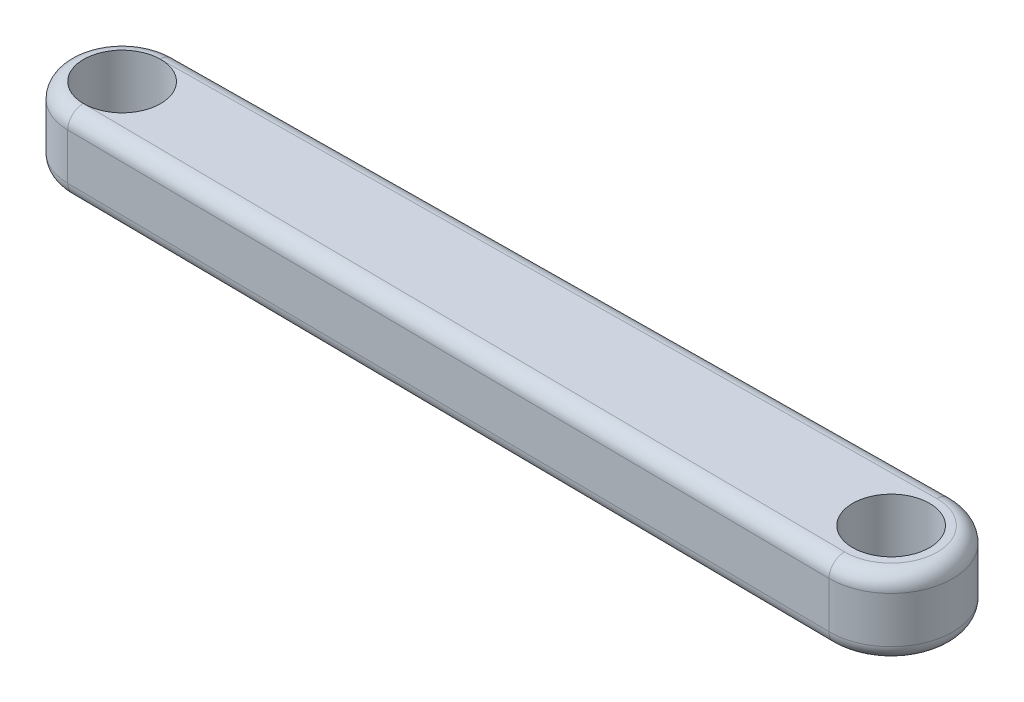
ISO-10303-21;
HEADER;
FILE_DESCRIPTION(('STEP AP214'),'2;1');
FILE_NAME('part.step','',(''),(''),'','','');
FILE_SCHEMA(('AUTOMOTIVE_DESIGN { 1 0 10303 214 1 1 1 1 }'));
ENDSEC;
DATA;
#1=APPLICATION_CONTEXT('core data for automotive mechanical design processes');
#2=APPLICATION_PROTOCOL_DEFINITION('international standard','automotive_design',2000,#1);
#3=PRODUCT_CONTEXT('',#1,'mechanical');
#4=PRODUCT('Part','Part','',(#3));
#5=PRODUCT_RELATED_PRODUCT_CATEGORY('part','',(#4));
#6=PRODUCT_DEFINITION_FORMATION('','',#4);
#7=PRODUCT_DEFINITION_CONTEXT('part definition',#1,'design');
#8=PRODUCT_DEFINITION('design','',#6,#7);
#9=PRODUCT_DEFINITION_SHAPE('','',#8);
#10=(LENGTH_UNIT() NAMED_UNIT(*) SI_UNIT(.MILLI.,.METRE.));
#11=(NAMED_UNIT(*) PLANE_ANGLE_UNIT() SI_UNIT($,.RADIAN.));
#12=(NAMED_UNIT(*) SI_UNIT($,.STERADIAN.) SOLID_ANGLE_UNIT());
#13=UNCERTAINTY_MEASURE_WITH_UNIT(LENGTH_MEASURE(1.E-05),#10,'distance_accuracy_value','');
#14=(GEOMETRIC_REPRESENTATION_CONTEXT(3) GLOBAL_UNCERTAINTY_ASSIGNED_CONTEXT((#13)) GLOBAL_UNIT_ASSIGNED_CONTEXT((#10,
#11,#12)) REPRESENTATION_CONTEXT('',''));
#15=CARTESIAN_POINT('',(0.,0.,0.));
#16=DIRECTION('',(0.,0.,1.));
#17=DIRECTION('',(1.,0.,0.));
#18=AXIS2_PLACEMENT_3D('',#15,#16,#17);
#19=CARTESIAN_POINT('',(-150.,50.,0.));
#20=DIRECTION('',(0.,1.,0.));
#21=DIRECTION('',(0.,0.,1.));
#22=AXIS2_PLACEMENT_3D('',#19,#20,#21);
#23=PLANE('',#22);
#24=CARTESIAN_POINT('',(-150.,50.,0.));
#25=DIRECTION('',(0.,1.,0.));
#26=DIRECTION('',(0.,0.,1.));
#27=AXIS2_PLACEMENT_3D('',#24,#25,#26);
#28=CIRCLE('',#27,25.);
#29=CARTESIAN_POINT('',(-150.25,50.,24.9987499687484));
#30=VERTEX_POINT('',#29);
#31=CARTESIAN_POINT('',(-150.25,50.,-24.9987499687485));
#32=VERTEX_POINT('',#31);
#33=EDGE_CURVE('E174',#30,#32,#28,.T.);
#34=ORIENTED_EDGE('',*,*,#33,.F.);
#35=DIRECTION('',(0.999949998749938,0.,0.00999999999999997));
#36=VECTOR('',#35,1.);
#37=CARTESIAN_POINT('',(349.7,50.,29.9984999624981));
#38=LINE('',#37,#36);
#39=CARTESIAN_POINT('',(349.7,50.,29.9984999624981));
#40=VERTEX_POINT('',#39);
#41=EDGE_CURVE('E54',#30,#40,#38,.T.);
#42=ORIENTED_EDGE('',*,*,#41,.T.);
#43=CARTESIAN_POINT('',(350.,50.,0.));
#44=DIRECTION('',(0.,1.,0.));
#45=DIRECTION('',(0.,0.,1.));
#46=AXIS2_PLACEMENT_3D('',#43,#44,#45);
#47=CIRCLE('',#46,30.);
#48=CARTESIAN_POINT('',(349.7,50.,-29.9984999624981));
#49=VERTEX_POINT('',#48);
#50=EDGE_CURVE('E199',#40,#49,#47,.T.);
#51=ORIENTED_EDGE('',*,*,#50,.T.);
#52=DIRECTION('',(-0.999949998749938,0.,0.00999999999999997));
#53=VECTOR('',#52,1.);
#54=CARTESIAN_POINT('',(-150.25,50.,-24.9987499687485));
#55=LINE('',#54,#53);
#56=EDGE_CURVE('E133',#49,#32,#55,.T.);
#57=ORIENTED_EDGE('',*,*,#56,.T.);
#58=EDGE_LOOP('',(#34,#42,#51,#57));
#59=FACE_BOUND('',#58,.T.);
#60=CARTESIAN_POINT('',(350.,50.,0.));
#61=DIRECTION('',(0.,1.,0.));
#62=DIRECTION('',(0.,0.,1.));
#63=AXIS2_PLACEMENT_3D('',#60,#61,#62);
#64=CIRCLE('',#63,25.);
#65=CARTESIAN_POINT('',(350.,50.,25.));
#66=VERTEX_POINT('',#65);
#67=EDGE_CURVE('E163',#66,#66,#64,.T.);
#68=ORIENTED_EDGE('',*,*,#67,.F.);
#69=EDGE_LOOP('',(#68));
#70=FACE_BOUND('',#69,.T.);
#71=ADVANCED_FACE('F37',(#59,#70),#23,.T.);
#72=CARTESIAN_POINT('',(-150.,0.,0.));
#73=DIRECTION('',(0.,1.,0.));
#74=DIRECTION('',(0.,0.,1.));
#75=AXIS2_PLACEMENT_3D('',#72,#73,#74);
#76=PLANE('',#75);
#77=CARTESIAN_POINT('',(350.,0.,0.));
#78=DIRECTION('',(0.,1.,0.));
#79=DIRECTION('',(0.,0.,1.));
#80=AXIS2_PLACEMENT_3D('',#77,#78,#79);
#81=CIRCLE('',#80,30.);
#82=CARTESIAN_POINT('',(349.7,0.,-29.9984999624981));
#83=VERTEX_POINT('',#82);
#84=CARTESIAN_POINT('',(349.7,0.,29.9984999624981));
#85=VERTEX_POINT('',#84);
#86=EDGE_CURVE('E185',#83,#85,#81,.F.);
#87=ORIENTED_EDGE('',*,*,#86,.T.);
#88=DIRECTION('',(0.999949998749938,0.,0.00999999999999997));
#89=VECTOR('',#88,1.);
#90=CARTESIAN_POINT('',(-150.25,0.,24.9987499687485));
#91=LINE('',#90,#89);
#92=CARTESIAN_POINT('',(-150.25,0.,24.9987499687484));
#93=VERTEX_POINT('',#92);
#94=EDGE_CURVE('E188',#85,#93,#91,.F.);
#95=ORIENTED_EDGE('',*,*,#94,.T.);
#96=CARTESIAN_POINT('',(-150.,0.,0.));
#97=DIRECTION('',(0.,1.,0.));
#98=DIRECTION('',(0.,0.,1.));
#99=AXIS2_PLACEMENT_3D('',#96,#97,#98);
#100=CIRCLE('',#99,25.);
#101=CARTESIAN_POINT('',(-150.25,0.,-24.9987499687485));
#102=VERTEX_POINT('',#101);
#103=EDGE_CURVE('E168',#93,#102,#100,.T.);
#104=ORIENTED_EDGE('',*,*,#103,.T.);
#105=DIRECTION('',(-0.999949998749938,0.,0.00999999999999997));
#106=VECTOR('',#105,1.);
#107=CARTESIAN_POINT('',(-150.25,0.,-24.9987499687485));
#108=LINE('',#107,#106);
#109=EDGE_CURVE('E183',#102,#83,#108,.F.);
#110=ORIENTED_EDGE('',*,*,#109,.T.);
#111=EDGE_LOOP('',(#87,#95,#104,#110));
#112=FACE_BOUND('',#111,.T.);
#113=CARTESIAN_POINT('',(350.,0.,0.));
#114=DIRECTION('',(0.,1.,0.));
#115=DIRECTION('',(0.,0.,1.));
#116=AXIS2_PLACEMENT_3D('',#113,#114,#115);
#117=CIRCLE('',#116,25.);
#118=CARTESIAN_POINT('',(350.,0.,25.));
#119=VERTEX_POINT('',#118);
#120=EDGE_CURVE('E157',#119,#119,#117,.T.);
#121=ORIENTED_EDGE('',*,*,#120,.T.);
#122=EDGE_LOOP('',(#121));
#123=FACE_BOUND('',#122,.T.);
#124=ADVANCED_FACE('F232',(#112,#123),#76,.F.);
#125=CARTESIAN_POINT('',(-150.,50.,0.));
#126=DIRECTION('',(0.,-1.,0.));
#127=DIRECTION('',(0.,0.,-1.));
#128=AXIS2_PLACEMENT_3D('',#125,#126,#127);
#129=CYLINDRICAL_SURFACE('',#128,35.);
#130=DIRECTION('',(0.,-1.,0.));
#131=VECTOR('',#130,1.);
#132=CARTESIAN_POINT('',(-150.35,50.,-34.9982499562478));
#133=LINE('',#132,#131);
#134=CARTESIAN_POINT('',(-150.35,40.,-34.9982499562478));
#135=VERTEX_POINT('',#134);
#136=CARTESIAN_POINT('',(-150.35,10.,-34.9982499562478));
#137=VERTEX_POINT('',#136);
#138=EDGE_CURVE('E111',#135,#137,#133,.T.);
#139=ORIENTED_EDGE('',*,*,#138,.T.);
#140=CARTESIAN_POINT('',(-150.,10.,0.));
#141=DIRECTION('',(0.,1.,0.));
#142=DIRECTION('',(0.,0.,1.));
#143=AXIS2_PLACEMENT_3D('',#140,#141,#142);
#144=CIRCLE('',#143,35.);
#145=CARTESIAN_POINT('',(-150.35,10.,34.9982499562478));
#146=VERTEX_POINT('',#145);
#147=EDGE_CURVE('E196',#137,#146,#144,.T.);
#148=ORIENTED_EDGE('',*,*,#147,.T.);
#149=DIRECTION('',(0.,-1.,0.));
#150=VECTOR('',#149,1.);
#151=CARTESIAN_POINT('',(-150.35,50.,34.9982499562478));
#152=LINE('',#151,#150);
#153=CARTESIAN_POINT('',(-150.35,40.,34.9982499562478));
#154=VERTEX_POINT('',#153);
#155=EDGE_CURVE('E130',#154,#146,#152,.T.);
#156=ORIENTED_EDGE('',*,*,#155,.F.);
#157=CARTESIAN_POINT('',(-150.,40.,0.));
#158=DIRECTION('',(0.,1.,0.));
#159=DIRECTION('',(0.,0.,1.));
#160=AXIS2_PLACEMENT_3D('',#157,#158,#159);
#161=CIRCLE('',#160,35.);
#162=EDGE_CURVE('E194',#154,#135,#161,.F.);
#163=ORIENTED_EDGE('',*,*,#162,.T.);
#164=EDGE_LOOP('',(#139,#148,#156,#163));
#165=FACE_BOUND('',#164,.T.);
#166=ADVANCED_FACE('F214',(#165),#129,.T.);
#167=CARTESIAN_POINT('',(-150.35,50.,34.9982499562478));
#168=DIRECTION('',(0.00999999999999997,0.,-0.999949998749938));
#169=DIRECTION('',(-0.999949998749938,0.,-0.00999999999999997));
#170=AXIS2_PLACEMENT_3D('',#167,#168,#169);
#171=PLANE('',#170);
#172=ORIENTED_EDGE('',*,*,#155,.T.);
#173=DIRECTION('',(0.999949998749938,0.,0.00999999999999997));
#174=VECTOR('',#173,1.);
#175=CARTESIAN_POINT('',(-150.35,10.,34.9982499562478));
#176=LINE('',#175,#174);
#177=CARTESIAN_POINT('',(349.6,10.,39.9979999499975));
#178=VERTEX_POINT('',#177);
#179=EDGE_CURVE('E192',#146,#178,#176,.T.);
#180=ORIENTED_EDGE('',*,*,#179,.T.);
#181=DIRECTION('',(0.,-1.,0.));
#182=VECTOR('',#181,1.);
#183=CARTESIAN_POINT('',(349.6,50.,39.9979999499975));
#184=LINE('',#183,#182);
#185=CARTESIAN_POINT('',(349.6,40.,39.9979999499975));
#186=VERTEX_POINT('',#185);
#187=EDGE_CURVE('E125',#186,#178,#184,.T.);
#188=ORIENTED_EDGE('',*,*,#187,.F.);
#189=DIRECTION('',(0.999949998749938,0.,0.00999999999999997));
#190=VECTOR('',#189,1.);
#191=CARTESIAN_POINT('',(-150.35,40.,34.9982499562478));
#192=LINE('',#191,#190);
#193=EDGE_CURVE('E190',#186,#154,#192,.F.);
#194=ORIENTED_EDGE('',*,*,#193,.T.);
#195=EDGE_LOOP('',(#172,#180,#188,#194));
#196=FACE_BOUND('',#195,.T.);
#197=ADVANCED_FACE('F212',(#196),#171,.F.);
#198=CARTESIAN_POINT('',(350.,50.,0.));
#199=DIRECTION('',(0.,-1.,0.));
#200=DIRECTION('',(0.,0.,-1.));
#201=AXIS2_PLACEMENT_3D('',#198,#199,#200);
#202=CYLINDRICAL_SURFACE('',#201,40.);
#203=ORIENTED_EDGE('',*,*,#187,.T.);
#204=CARTESIAN_POINT('',(350.,10.,0.));
#205=DIRECTION('',(0.,1.,0.));
#206=DIRECTION('',(0.,0.,1.));
#207=AXIS2_PLACEMENT_3D('',#204,#205,#206);
#208=CIRCLE('',#207,40.);
#209=CARTESIAN_POINT('',(349.6,10.,-39.9979999499975));
#210=VERTEX_POINT('',#209);
#211=EDGE_CURVE('E124',#178,#210,#208,.T.);
#212=ORIENTED_EDGE('',*,*,#211,.T.);
#213=DIRECTION('',(0.,-1.,0.));
#214=VECTOR('',#213,1.);
#215=CARTESIAN_POINT('',(349.6,50.,-39.9979999499975));
#216=LINE('',#215,#214);
#217=CARTESIAN_POINT('',(349.6,40.,-39.9979999499975));
#218=VERTEX_POINT('',#217);
#219=EDGE_CURVE('E109',#218,#210,#216,.T.);
#220=ORIENTED_EDGE('',*,*,#219,.F.);
#221=CARTESIAN_POINT('',(350.,40.,0.));
#222=DIRECTION('',(0.,1.,0.));
#223=DIRECTION('',(0.,0.,1.));
#224=AXIS2_PLACEMENT_3D('',#221,#222,#223);
#225=CIRCLE('',#224,40.);
#226=EDGE_CURVE('E121',#218,#186,#225,.F.);
#227=ORIENTED_EDGE('',*,*,#226,.T.);
#228=EDGE_LOOP('',(#203,#212,#220,#227));
#229=FACE_BOUND('',#228,.T.);
#230=ADVANCED_FACE('F120',(#229),#202,.T.);
#231=CARTESIAN_POINT('',(-150.35,50.,-34.9982499562478));
#232=DIRECTION('',(0.00999999999999997,0.,0.999949998749938));
#233=DIRECTION('',(0.999949998749938,0.,-0.00999999999999997));
#234=AXIS2_PLACEMENT_3D('',#231,#232,#233);
#235=PLANE('',#234);
#236=ORIENTED_EDGE('',*,*,#219,.T.);
#237=DIRECTION('',(-0.999949998749938,0.,0.00999999999999997));
#238=VECTOR('',#237,1.);
#239=CARTESIAN_POINT('',(-150.35,10.,-34.9982499562478));
#240=LINE('',#239,#238);
#241=EDGE_CURVE('E11',#210,#137,#240,.T.);
#242=ORIENTED_EDGE('',*,*,#241,.T.);
#243=ORIENTED_EDGE('',*,*,#138,.F.);
#244=DIRECTION('',(-0.999949998749938,0.,0.00999999999999997));
#245=VECTOR('',#244,1.);
#246=CARTESIAN_POINT('',(349.6,40.,-39.9979999499975));
#247=LINE('',#246,#245);
#248=EDGE_CURVE('E46',#135,#218,#247,.F.);
#249=ORIENTED_EDGE('',*,*,#248,.T.);
#250=EDGE_LOOP('',(#236,#242,#243,#249));
#251=FACE_BOUND('',#250,.T.);
#252=ADVANCED_FACE('F108',(#251),#235,.F.);
#253=CARTESIAN_POINT('',(-150.,50.,0.));
#254=DIRECTION('',(0.,-1.,0.));
#255=DIRECTION('',(0.,0.,-1.));
#256=AXIS2_PLACEMENT_3D('',#253,#254,#255);
#257=CYLINDRICAL_SURFACE('',#256,25.);
#258=EDGE_CURVE('E171',#32,#30,#28,.T.);
#259=ORIENTED_EDGE('',*,*,#258,.T.);
#260=ORIENTED_EDGE('',*,*,#33,.T.);
#261=EDGE_LOOP('',(#259,#260));
#262=FACE_BOUND('',#261,.T.);
#263=EDGE_CURVE('E175',#102,#93,#100,.T.);
#264=ORIENTED_EDGE('',*,*,#263,.F.);
#265=ORIENTED_EDGE('',*,*,#103,.F.);
#266=EDGE_LOOP('',(#264,#265));
#267=FACE_BOUND('',#266,.T.);
#268=ADVANCED_FACE('F205',(#262,#267),#257,.F.);
#269=CARTESIAN_POINT('',(350.,50.,0.));
#270=DIRECTION('',(0.,-1.,0.));
#271=DIRECTION('',(0.,0.,-1.));
#272=AXIS2_PLACEMENT_3D('',#269,#270,#271);
#273=CYLINDRICAL_SURFACE('',#272,25.);
#274=ORIENTED_EDGE('',*,*,#67,.T.);
#275=EDGE_LOOP('',(#274));
#276=FACE_BOUND('',#275,.T.);
#277=ORIENTED_EDGE('',*,*,#120,.F.);
#278=EDGE_LOOP('',(#277));
#279=FACE_BOUND('',#278,.T.);
#280=ADVANCED_FACE('F270',(#276,#279),#273,.F.);
#281=CARTESIAN_POINT('',(-150.,10.,0.));
#282=DIRECTION('',(0.,1.,0.));
#283=DIRECTION('',(0.,0.,1.));
#284=AXIS2_PLACEMENT_3D('',#281,#282,#283);
#285=TOROIDAL_SURFACE('',#284,25.,10.);
#286=CARTESIAN_POINT('',(-150.25,10.,-24.9987499687485));
#287=DIRECTION('',(0.999949998749938,0.,-0.0099999999999989));
#288=DIRECTION('',(-0.0099999999999989,0.,-0.999949998749938));
#289=AXIS2_PLACEMENT_3D('',#286,#287,#288);
#290=CIRCLE('',#289,10.);
#291=EDGE_CURVE('E150',#102,#137,#290,.T.);
#292=ORIENTED_EDGE('',*,*,#291,.F.);
#293=ORIENTED_EDGE('',*,*,#263,.T.);
#294=CARTESIAN_POINT('',(-150.25,10.,24.9987499687485));
#295=DIRECTION('',(0.999949998749938,0.,0.0099999999999989));
#296=DIRECTION('',(0.0099999999999989,0.,-0.999949998749938));
#297=AXIS2_PLACEMENT_3D('',#294,#295,#296);
#298=CIRCLE('',#297,10.);
#299=EDGE_CURVE('E138',#146,#93,#298,.T.);
#300=ORIENTED_EDGE('',*,*,#299,.F.);
#301=ORIENTED_EDGE('',*,*,#147,.F.);
#302=EDGE_LOOP('',(#292,#293,#300,#301));
#303=FACE_BOUND('',#302,.T.);
#304=ADVANCED_FACE('F217',(#303),#285,.T.);
#305=CARTESIAN_POINT('',(-150.25,10.,24.9987499687485));
#306=DIRECTION('',(0.999949998749938,0.,0.00999999999999997));
#307=DIRECTION('',(0.00999999999999997,0.,-0.999949998749938));
#308=AXIS2_PLACEMENT_3D('',#305,#306,#307);
#309=CYLINDRICAL_SURFACE('',#308,10.);
#310=ORIENTED_EDGE('',*,*,#299,.T.);
#311=ORIENTED_EDGE('',*,*,#94,.F.);
#312=CARTESIAN_POINT('',(349.7,10.,29.9984999624981));
#313=DIRECTION('',(0.999949998749938,0.,0.0099999999999989));
#314=DIRECTION('',(0.0099999999999989,0.,-0.999949998749938));
#315=AXIS2_PLACEMENT_3D('',#312,#313,#314);
#316=CIRCLE('',#315,10.);
#317=EDGE_CURVE('E144',#178,#85,#316,.T.);
#318=ORIENTED_EDGE('',*,*,#317,.F.);
#319=ORIENTED_EDGE('',*,*,#179,.F.);
#320=EDGE_LOOP('',(#310,#311,#318,#319));
#321=FACE_BOUND('',#320,.T.);
#322=ADVANCED_FACE('F220',(#321),#309,.T.);
#323=CARTESIAN_POINT('',(-150.25,10.,-24.9987499687485));
#324=DIRECTION('',(-0.999949998749938,0.,0.00999999999999997));
#325=DIRECTION('',(0.00999999999999997,0.,0.999949998749938));
#326=AXIS2_PLACEMENT_3D('',#323,#324,#325);
#327=CYLINDRICAL_SURFACE('',#326,10.);
#328=ORIENTED_EDGE('',*,*,#291,.T.);
#329=ORIENTED_EDGE('',*,*,#241,.F.);
#330=CARTESIAN_POINT('',(349.7,10.,-29.9984999624981));
#331=DIRECTION('',(0.999949998749938,0.,-0.0099999999999989));
#332=DIRECTION('',(-0.0099999999999989,0.,-0.999949998749938));
#333=AXIS2_PLACEMENT_3D('',#330,#331,#332);
#334=CIRCLE('',#333,10.);
#335=EDGE_CURVE('E141',#83,#210,#334,.T.);
#336=ORIENTED_EDGE('',*,*,#335,.F.);
#337=ORIENTED_EDGE('',*,*,#109,.F.);
#338=EDGE_LOOP('',(#328,#329,#336,#337));
#339=FACE_BOUND('',#338,.T.);
#340=ADVANCED_FACE('F223',(#339),#327,.T.);
#341=CARTESIAN_POINT('',(350.,10.,0.));
#342=DIRECTION('',(0.,1.,0.));
#343=DIRECTION('',(0.,0.,1.));
#344=AXIS2_PLACEMENT_3D('',#341,#342,#343);
#345=TOROIDAL_SURFACE('',#344,30.,10.);
#346=ORIENTED_EDGE('',*,*,#317,.T.);
#347=ORIENTED_EDGE('',*,*,#86,.F.);
#348=ORIENTED_EDGE('',*,*,#335,.T.);
#349=ORIENTED_EDGE('',*,*,#211,.F.);
#350=EDGE_LOOP('',(#346,#347,#348,#349));
#351=FACE_BOUND('',#350,.T.);
#352=ADVANCED_FACE('F221',(#351),#345,.T.);
#353=CARTESIAN_POINT('',(-150.,40.,0.));
#354=DIRECTION('',(0.,1.,0.));
#355=DIRECTION('',(0.,0.,1.));
#356=AXIS2_PLACEMENT_3D('',#353,#354,#355);
#357=TOROIDAL_SURFACE('',#356,25.,10.);
#358=CARTESIAN_POINT('',(-150.25,40.,-24.9987499687485));
#359=DIRECTION('',(0.999949998749938,0.,-0.0099999999999989));
#360=DIRECTION('',(-0.0099999999999989,0.,-0.999949998749938));
#361=AXIS2_PLACEMENT_3D('',#358,#359,#360);
#362=CIRCLE('',#361,10.);
#363=EDGE_CURVE('E135',#135,#32,#362,.T.);
#364=ORIENTED_EDGE('',*,*,#363,.F.);
#365=ORIENTED_EDGE('',*,*,#162,.F.);
#366=CARTESIAN_POINT('',(-150.25,40.,24.9987499687485));
#367=DIRECTION('',(0.999949998749938,0.,0.0099999999999989));
#368=DIRECTION('',(0.0099999999999989,0.,-0.999949998749938));
#369=AXIS2_PLACEMENT_3D('',#366,#367,#368);
#370=CIRCLE('',#369,10.);
#371=EDGE_CURVE('E41',#30,#154,#370,.T.);
#372=ORIENTED_EDGE('',*,*,#371,.F.);
#373=ORIENTED_EDGE('',*,*,#258,.F.);
#374=EDGE_LOOP('',(#364,#365,#372,#373));
#375=FACE_BOUND('',#374,.T.);
#376=ADVANCED_FACE('F39',(#375),#357,.T.);
#377=CARTESIAN_POINT('',(-150.25,40.,24.9987499687485));
#378=DIRECTION('',(-0.999949998749938,0.,-0.00999999999999997));
#379=DIRECTION('',(-0.00999999999999997,0.,0.999949998749938));
#380=AXIS2_PLACEMENT_3D('',#377,#378,#379);
#381=CYLINDRICAL_SURFACE('',#380,10.);
#382=ORIENTED_EDGE('',*,*,#371,.T.);
#383=ORIENTED_EDGE('',*,*,#193,.F.);
#384=CARTESIAN_POINT('',(349.7,40.,29.9984999624981));
#385=DIRECTION('',(0.999949998749938,0.,0.0099999999999989));
#386=DIRECTION('',(0.0099999999999989,0.,-0.999949998749938));
#387=AXIS2_PLACEMENT_3D('',#384,#385,#386);
#388=CIRCLE('',#387,10.);
#389=EDGE_CURVE('E128',#40,#186,#388,.T.);
#390=ORIENTED_EDGE('',*,*,#389,.F.);
#391=ORIENTED_EDGE('',*,*,#41,.F.);
#392=EDGE_LOOP('',(#382,#383,#390,#391));
#393=FACE_BOUND('',#392,.T.);
#394=ADVANCED_FACE('F209',(#393),#381,.T.);
#395=CARTESIAN_POINT('',(-150.25,40.,-24.9987499687485));
#396=DIRECTION('',(0.999949998749938,0.,-0.00999999999999997));
#397=DIRECTION('',(-0.00999999999999997,0.,-0.999949998749938));
#398=AXIS2_PLACEMENT_3D('',#395,#396,#397);
#399=CYLINDRICAL_SURFACE('',#398,10.);
#400=ORIENTED_EDGE('',*,*,#363,.T.);
#401=ORIENTED_EDGE('',*,*,#56,.F.);
#402=CARTESIAN_POINT('',(349.7,40.,-29.9984999624981));
#403=DIRECTION('',(0.999949998749938,0.,-0.0099999999999989));
#404=DIRECTION('',(-0.0099999999999989,0.,-0.999949998749938));
#405=AXIS2_PLACEMENT_3D('',#402,#403,#404);
#406=CIRCLE('',#405,10.);
#407=EDGE_CURVE('E62',#218,#49,#406,.T.);
#408=ORIENTED_EDGE('',*,*,#407,.F.);
#409=ORIENTED_EDGE('',*,*,#248,.F.);
#410=EDGE_LOOP('',(#400,#401,#408,#409));
#411=FACE_BOUND('',#410,.T.);
#412=ADVANCED_FACE('F132',(#411),#399,.T.);
#413=CARTESIAN_POINT('',(350.,40.,0.));
#414=DIRECTION('',(0.,1.,0.));
#415=DIRECTION('',(0.,0.,1.));
#416=AXIS2_PLACEMENT_3D('',#413,#414,#415);
#417=TOROIDAL_SURFACE('',#416,30.,10.);
#418=ORIENTED_EDGE('',*,*,#389,.T.);
#419=ORIENTED_EDGE('',*,*,#226,.F.);
#420=ORIENTED_EDGE('',*,*,#407,.T.);
#421=ORIENTED_EDGE('',*,*,#50,.F.);
#422=EDGE_LOOP('',(#418,#419,#420,#421));
#423=FACE_BOUND('',#422,.T.);
#424=ADVANCED_FACE('F127',(#423),#417,.T.);
#425=CLOSED_SHELL('',(#71,#124,#166,#197,#230,#252,#268,#280,#304,#322,#340,#352,#376,#394,#412,#424));
#426=MANIFOLD_SOLID_BREP('B2',#425);
#427=ADVANCED_BREP_SHAPE_REPRESENTATION('',(#18,#426),#14);
#428=SHAPE_DEFINITION_REPRESENTATION(#9,#427);
ENDSEC;
END-ISO-10303-21;
